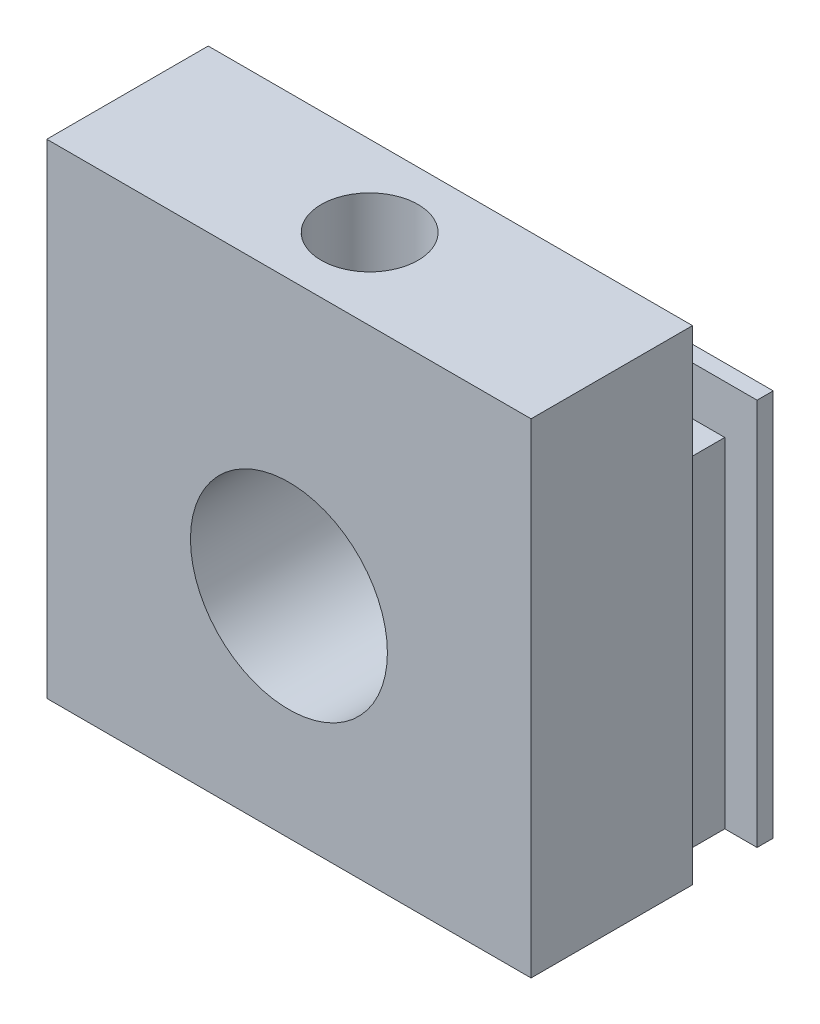
ISO-10303-21;
HEADER;
FILE_DESCRIPTION(('STEP AP214'),'2;1');
FILE_NAME('part.step','',(''),(''),'','','');
FILE_SCHEMA(('AUTOMOTIVE_DESIGN { 1 0 10303 214 1 1 1 1 }'));
ENDSEC;
DATA;
#1=APPLICATION_CONTEXT('core data for automotive mechanical design processes');
#2=APPLICATION_PROTOCOL_DEFINITION('international standard','automotive_design',2000,#1);
#3=PRODUCT_CONTEXT('',#1,'mechanical');
#4=PRODUCT('Part','Part','',(#3));
#5=PRODUCT_RELATED_PRODUCT_CATEGORY('part','',(#4));
#6=PRODUCT_DEFINITION_FORMATION('','',#4);
#7=PRODUCT_DEFINITION_CONTEXT('part definition',#1,'design');
#8=PRODUCT_DEFINITION('design','',#6,#7);
#9=PRODUCT_DEFINITION_SHAPE('','',#8);
#10=(LENGTH_UNIT() NAMED_UNIT(*) SI_UNIT(.MILLI.,.METRE.));
#11=(NAMED_UNIT(*) PLANE_ANGLE_UNIT() SI_UNIT($,.RADIAN.));
#12=(NAMED_UNIT(*) SI_UNIT($,.STERADIAN.) SOLID_ANGLE_UNIT());
#13=UNCERTAINTY_MEASURE_WITH_UNIT(LENGTH_MEASURE(1.E-05),#10,'distance_accuracy_value','');
#14=(GEOMETRIC_REPRESENTATION_CONTEXT(3) GLOBAL_UNCERTAINTY_ASSIGNED_CONTEXT((#13)) GLOBAL_UNIT_ASSIGNED_CONTEXT((#10,
#11,#12)) REPRESENTATION_CONTEXT('',''));
#15=CARTESIAN_POINT('',(0.,0.,0.));
#16=DIRECTION('',(0.,0.,1.));
#17=DIRECTION('',(1.,0.,0.));
#18=AXIS2_PLACEMENT_3D('',#15,#16,#17);
#19=CARTESIAN_POINT('',(0.,0.,0.));
#20=DIRECTION('',(0.,0.,1.));
#21=DIRECTION('',(1.,0.,0.));
#22=AXIS2_PLACEMENT_3D('',#19,#20,#21);
#23=PLANE('',#22);
#24=DIRECTION('',(0.,1.,0.));
#25=VECTOR('',#24,1.);
#26=CARTESIAN_POINT('',(-6.5,-7.5,0.));
#27=LINE('',#26,#25);
#28=CARTESIAN_POINT('',(-6.5,-7.5,0.));
#29=VERTEX_POINT('',#28);
#30=CARTESIAN_POINT('',(-6.5,3.,0.));
#31=VERTEX_POINT('',#30);
#32=EDGE_CURVE('E211',#29,#31,#27,.T.);
#33=ORIENTED_EDGE('',*,*,#32,.F.);
#34=DIRECTION('',(1.,0.,0.));
#35=VECTOR('',#34,1.);
#36=CARTESIAN_POINT('',(-7.5,-7.5,0.));
#37=LINE('',#36,#35);
#38=CARTESIAN_POINT('',(-7.5,-7.5,0.));
#39=VERTEX_POINT('',#38);
#40=EDGE_CURVE('E253',#39,#29,#37,.T.);
#41=ORIENTED_EDGE('',*,*,#40,.F.);
#42=DIRECTION('',(0.,-1.,0.));
#43=VECTOR('',#42,1.);
#44=CARTESIAN_POINT('',(-7.5,7.5,0.));
#45=LINE('',#44,#43);
#46=CARTESIAN_POINT('',(-7.5,7.5,0.));
#47=VERTEX_POINT('',#46);
#48=EDGE_CURVE('E234',#47,#39,#45,.T.);
#49=ORIENTED_EDGE('',*,*,#48,.F.);
#50=DIRECTION('',(-1.,0.,0.));
#51=VECTOR('',#50,1.);
#52=CARTESIAN_POINT('',(-7.5,7.5,0.));
#53=LINE('',#52,#51);
#54=CARTESIAN_POINT('',(7.5,7.5,0.));
#55=VERTEX_POINT('',#54);
#56=EDGE_CURVE('E84',#55,#47,#53,.T.);
#57=ORIENTED_EDGE('',*,*,#56,.F.);
#58=DIRECTION('',(0.,1.,0.));
#59=VECTOR('',#58,1.);
#60=CARTESIAN_POINT('',(7.5,7.5,0.));
#61=LINE('',#60,#59);
#62=CARTESIAN_POINT('',(7.5,-7.5,0.));
#63=VERTEX_POINT('',#62);
#64=EDGE_CURVE('E257',#63,#55,#61,.T.);
#65=ORIENTED_EDGE('',*,*,#64,.F.);
#66=CARTESIAN_POINT('',(6.5,-7.5,0.));
#67=VERTEX_POINT('',#66);
#68=EDGE_CURVE('E252',#67,#63,#37,.T.);
#69=ORIENTED_EDGE('',*,*,#68,.F.);
#70=DIRECTION('',(0.,1.,0.));
#71=VECTOR('',#70,1.);
#72=CARTESIAN_POINT('',(6.5,-7.5,0.));
#73=LINE('',#72,#71);
#74=CARTESIAN_POINT('',(6.5,3.,0.));
#75=VERTEX_POINT('',#74);
#76=EDGE_CURVE('E200',#67,#75,#73,.T.);
#77=ORIENTED_EDGE('',*,*,#76,.T.);
#78=DIRECTION('',(-1.,0.,0.));
#79=VECTOR('',#78,1.);
#80=CARTESIAN_POINT('',(6.5,3.,0.));
#81=LINE('',#80,#79);
#82=EDGE_CURVE('E54',#75,#31,#81,.T.);
#83=ORIENTED_EDGE('',*,*,#82,.T.);
#84=EDGE_LOOP('',(#33,#41,#49,#57,#65,#69,#77,#83));
#85=FACE_BOUND('',#84,.T.);
#86=ADVANCED_FACE('F38',(#85),#23,.F.);
#87=CARTESIAN_POINT('',(-7.5,7.5,5.));
#88=DIRECTION('',(1.,0.,0.));
#89=DIRECTION('',(0.,1.,0.));
#90=AXIS2_PLACEMENT_3D('',#87,#88,#89);
#91=PLANE('',#90);
#92=ORIENTED_EDGE('',*,*,#48,.T.);
#93=DIRECTION('',(0.,0.,-1.));
#94=VECTOR('',#93,1.);
#95=CARTESIAN_POINT('',(-7.5,-7.5,5.));
#96=LINE('',#95,#94);
#97=CARTESIAN_POINT('',(-7.5,-7.5,5.));
#98=VERTEX_POINT('',#97);
#99=EDGE_CURVE('E11',#98,#39,#96,.T.);
#100=ORIENTED_EDGE('',*,*,#99,.F.);
#101=DIRECTION('',(0.,-1.,0.));
#102=VECTOR('',#101,1.);
#103=CARTESIAN_POINT('',(-7.5,7.5,5.));
#104=LINE('',#103,#102);
#105=CARTESIAN_POINT('',(-7.5,7.5,5.));
#106=VERTEX_POINT('',#105);
#107=EDGE_CURVE('E238',#106,#98,#104,.T.);
#108=ORIENTED_EDGE('',*,*,#107,.F.);
#109=DIRECTION('',(0.,0.,-1.));
#110=VECTOR('',#109,1.);
#111=CARTESIAN_POINT('',(-7.5,7.5,5.));
#112=LINE('',#111,#110);
#113=EDGE_CURVE('E248',#106,#47,#112,.T.);
#114=ORIENTED_EDGE('',*,*,#113,.T.);
#115=EDGE_LOOP('',(#92,#100,#108,#114));
#116=FACE_BOUND('',#115,.T.);
#117=ADVANCED_FACE('F40',(#116),#91,.F.);
#118=CARTESIAN_POINT('',(-7.5,-7.5,5.));
#119=DIRECTION('',(0.,1.,0.));
#120=DIRECTION('',(-1.,0.,0.));
#121=AXIS2_PLACEMENT_3D('',#118,#119,#120);
#122=PLANE('',#121);
#123=ORIENTED_EDGE('',*,*,#40,.T.);
#124=DIRECTION('',(0.,0.,1.));
#125=VECTOR('',#124,1.);
#126=CARTESIAN_POINT('',(-6.5,-7.5,-2.));
#127=LINE('',#126,#125);
#128=CARTESIAN_POINT('',(-6.5,-7.5,-2.));
#129=VERTEX_POINT('',#128);
#130=EDGE_CURVE('E225',#129,#29,#127,.T.);
#131=ORIENTED_EDGE('',*,*,#130,.F.);
#132=DIRECTION('',(-1.,0.,0.));
#133=VECTOR('',#132,1.);
#134=CARTESIAN_POINT('',(7.5,-7.5,-2.));
#135=LINE('',#134,#133);
#136=CARTESIAN_POINT('',(-7.5,-7.5,-2.));
#137=VERTEX_POINT('',#136);
#138=EDGE_CURVE('E185',#129,#137,#135,.T.);
#139=ORIENTED_EDGE('',*,*,#138,.T.);
#140=DIRECTION('',(0.,0.,1.));
#141=VECTOR('',#140,1.);
#142=CARTESIAN_POINT('',(-7.5,-7.5,-2.5));
#143=LINE('',#142,#141);
#144=CARTESIAN_POINT('',(-7.5,-7.5,-2.5));
#145=VERTEX_POINT('',#144);
#146=EDGE_CURVE('E160',#145,#137,#143,.T.);
#147=ORIENTED_EDGE('',*,*,#146,.F.);
#148=DIRECTION('',(-1.,0.,0.));
#149=VECTOR('',#148,1.);
#150=CARTESIAN_POINT('',(7.5,-7.5,-2.5));
#151=LINE('',#150,#149);
#152=CARTESIAN_POINT('',(7.5,-7.5,-2.5));
#153=VERTEX_POINT('',#152);
#154=EDGE_CURVE('E145',#153,#145,#151,.T.);
#155=ORIENTED_EDGE('',*,*,#154,.F.);
#156=DIRECTION('',(0.,0.,1.));
#157=VECTOR('',#156,1.);
#158=CARTESIAN_POINT('',(7.5,-7.5,-2.5));
#159=LINE('',#158,#157);
#160=CARTESIAN_POINT('',(7.5,-7.5,-2.));
#161=VERTEX_POINT('',#160);
#162=EDGE_CURVE('E191',#153,#161,#159,.T.);
#163=ORIENTED_EDGE('',*,*,#162,.T.);
#164=CARTESIAN_POINT('',(6.5,-7.5,-2.));
#165=VERTEX_POINT('',#164);
#166=EDGE_CURVE('E170',#161,#165,#135,.T.);
#167=ORIENTED_EDGE('',*,*,#166,.T.);
#168=DIRECTION('',(0.,0.,1.));
#169=VECTOR('',#168,1.);
#170=CARTESIAN_POINT('',(6.5,-7.5,-2.));
#171=LINE('',#170,#169);
#172=EDGE_CURVE('E222',#165,#67,#171,.T.);
#173=ORIENTED_EDGE('',*,*,#172,.T.);
#174=ORIENTED_EDGE('',*,*,#68,.T.);
#175=DIRECTION('',(0.,0.,-1.));
#176=VECTOR('',#175,1.);
#177=CARTESIAN_POINT('',(7.5,-7.5,5.));
#178=LINE('',#177,#176);
#179=CARTESIAN_POINT('',(7.5,-7.5,5.));
#180=VERTEX_POINT('',#179);
#181=EDGE_CURVE('E47',#180,#63,#178,.T.);
#182=ORIENTED_EDGE('',*,*,#181,.F.);
#183=DIRECTION('',(1.,0.,0.));
#184=VECTOR('',#183,1.);
#185=CARTESIAN_POINT('',(-7.5,-7.5,5.));
#186=LINE('',#185,#184);
#187=EDGE_CURVE('E91',#98,#180,#186,.T.);
#188=ORIENTED_EDGE('',*,*,#187,.F.);
#189=ORIENTED_EDGE('',*,*,#99,.T.);
#190=EDGE_LOOP('',(#123,#131,#139,#147,#155,#163,#167,#173,#174,#182,#188,#189));
#191=FACE_BOUND('',#190,.T.);
#192=ADVANCED_FACE('F292',(#191),#122,.F.);
#193=CARTESIAN_POINT('',(7.5,7.5,5.));
#194=DIRECTION('',(-1.,0.,0.));
#195=DIRECTION('',(0.,-1.,0.));
#196=AXIS2_PLACEMENT_3D('',#193,#194,#195);
#197=PLANE('',#196);
#198=ORIENTED_EDGE('',*,*,#64,.T.);
#199=DIRECTION('',(0.,0.,-1.));
#200=VECTOR('',#199,1.);
#201=CARTESIAN_POINT('',(7.5,7.5,5.));
#202=LINE('',#201,#200);
#203=CARTESIAN_POINT('',(7.5,7.5,5.));
#204=VERTEX_POINT('',#203);
#205=EDGE_CURVE('E264',#204,#55,#202,.T.);
#206=ORIENTED_EDGE('',*,*,#205,.F.);
#207=DIRECTION('',(0.,1.,0.));
#208=VECTOR('',#207,1.);
#209=CARTESIAN_POINT('',(7.5,7.5,5.));
#210=LINE('',#209,#208);
#211=EDGE_CURVE('E243',#180,#204,#210,.T.);
#212=ORIENTED_EDGE('',*,*,#211,.F.);
#213=ORIENTED_EDGE('',*,*,#181,.T.);
#214=EDGE_LOOP('',(#198,#206,#212,#213));
#215=FACE_BOUND('',#214,.T.);
#216=ADVANCED_FACE('F271',(#215),#197,.F.);
#217=CARTESIAN_POINT('',(-7.5,7.5,5.));
#218=DIRECTION('',(0.,-1.,0.));
#219=DIRECTION('',(0.,0.,-1.));
#220=AXIS2_PLACEMENT_3D('',#217,#218,#219);
#221=PLANE('',#220);
#222=CARTESIAN_POINT('',(0.,7.5,2.5));
#223=DIRECTION('',(0.,1.,0.));
#224=DIRECTION('',(0.,0.,1.));
#225=AXIS2_PLACEMENT_3D('',#222,#223,#224);
#226=CIRCLE('',#225,1.5);
#227=CARTESIAN_POINT('',(0.,7.5,4.));
#228=VERTEX_POINT('',#227);
#229=EDGE_CURVE('E221',#228,#228,#226,.T.);
#230=ORIENTED_EDGE('',*,*,#229,.F.);
#231=EDGE_LOOP('',(#230));
#232=FACE_BOUND('',#231,.T.);
#233=ORIENTED_EDGE('',*,*,#56,.T.);
#234=ORIENTED_EDGE('',*,*,#113,.F.);
#235=DIRECTION('',(-1.,0.,0.));
#236=VECTOR('',#235,1.);
#237=CARTESIAN_POINT('',(-7.5,7.5,5.));
#238=LINE('',#237,#236);
#239=EDGE_CURVE('E63',#204,#106,#238,.T.);
#240=ORIENTED_EDGE('',*,*,#239,.F.);
#241=ORIENTED_EDGE('',*,*,#205,.T.);
#242=EDGE_LOOP('',(#233,#234,#240,#241));
#243=FACE_BOUND('',#242,.T.);
#244=ADVANCED_FACE('F280',(#232,#243),#221,.F.);
#245=CARTESIAN_POINT('',(0.,0.,5.));
#246=DIRECTION('',(0.,0.,1.));
#247=DIRECTION('',(1.,0.,0.));
#248=AXIS2_PLACEMENT_3D('',#245,#246,#247);
#249=PLANE('',#248);
#250=CARTESIAN_POINT('',(0.,-1.,5.));
#251=DIRECTION('',(0.,0.,1.));
#252=DIRECTION('',(1.,0.,0.));
#253=AXIS2_PLACEMENT_3D('',#250,#251,#252);
#254=CIRCLE('',#253,3.05);
#255=CARTESIAN_POINT('',(3.05,-1.,5.));
#256=VERTEX_POINT('',#255);
#257=EDGE_CURVE('E344',#256,#256,#254,.T.);
#258=ORIENTED_EDGE('',*,*,#257,.F.);
#259=EDGE_LOOP('',(#258));
#260=FACE_BOUND('',#259,.T.);
#261=ORIENTED_EDGE('',*,*,#107,.T.);
#262=ORIENTED_EDGE('',*,*,#187,.T.);
#263=ORIENTED_EDGE('',*,*,#211,.T.);
#264=ORIENTED_EDGE('',*,*,#239,.T.);
#265=EDGE_LOOP('',(#261,#262,#263,#264));
#266=FACE_BOUND('',#265,.T.);
#267=ADVANCED_FACE('F282',(#260,#266),#249,.T.);
#268=CARTESIAN_POINT('',(0.,4.5,2.5));
#269=DIRECTION('',(0.,1.,0.));
#270=DIRECTION('',(0.,0.,1.));
#271=AXIS2_PLACEMENT_3D('',#268,#269,#270);
#272=CYLINDRICAL_SURFACE('',#271,1.5);
#273=CARTESIAN_POINT('',(0.,4.5,2.5));
#274=DIRECTION('',(0.,1.,0.));
#275=DIRECTION('',(0.,0.,1.));
#276=AXIS2_PLACEMENT_3D('',#273,#274,#275);
#277=CIRCLE('',#276,1.5);
#278=CARTESIAN_POINT('',(0.,4.5,4.));
#279=VERTEX_POINT('',#278);
#280=EDGE_CURVE('E230',#279,#279,#277,.T.);
#281=ORIENTED_EDGE('',*,*,#280,.F.);
#282=EDGE_LOOP('',(#281));
#283=FACE_BOUND('',#282,.T.);
#284=ORIENTED_EDGE('',*,*,#229,.T.);
#285=EDGE_LOOP('',(#284));
#286=FACE_BOUND('',#285,.T.);
#287=ADVANCED_FACE('F289',(#283,#286),#272,.F.);
#288=CARTESIAN_POINT('',(0.,4.5,2.5));
#289=DIRECTION('',(0.,1.,0.));
#290=DIRECTION('',(0.,0.,1.));
#291=AXIS2_PLACEMENT_3D('',#288,#289,#290);
#292=PLANE('',#291);
#293=ORIENTED_EDGE('',*,*,#280,.T.);
#294=EDGE_LOOP('',(#293));
#295=FACE_BOUND('',#294,.T.);
#296=ADVANCED_FACE('F303',(#295),#292,.T.);
#297=CARTESIAN_POINT('',(6.5,3.,-2.));
#298=DIRECTION('',(0.,1.,0.));
#299=DIRECTION('',(-1.,0.,0.));
#300=AXIS2_PLACEMENT_3D('',#297,#298,#299);
#301=PLANE('',#300);
#302=ORIENTED_EDGE('',*,*,#82,.F.);
#303=DIRECTION('',(0.,0.,1.));
#304=VECTOR('',#303,1.);
#305=CARTESIAN_POINT('',(6.5,3.,-2.));
#306=LINE('',#305,#304);
#307=CARTESIAN_POINT('',(6.5,3.,-2.));
#308=VERTEX_POINT('',#307);
#309=EDGE_CURVE('E218',#308,#75,#306,.T.);
#310=ORIENTED_EDGE('',*,*,#309,.F.);
#311=DIRECTION('',(-1.,0.,0.));
#312=VECTOR('',#311,1.);
#313=CARTESIAN_POINT('',(6.5,3.,-2.));
#314=LINE('',#313,#312);
#315=CARTESIAN_POINT('',(-6.5,3.,-2.));
#316=VERTEX_POINT('',#315);
#317=EDGE_CURVE('E196',#308,#316,#314,.T.);
#318=ORIENTED_EDGE('',*,*,#317,.T.);
#319=DIRECTION('',(0.,0.,1.));
#320=VECTOR('',#319,1.);
#321=CARTESIAN_POINT('',(-6.5,3.,-2.));
#322=LINE('',#321,#320);
#323=EDGE_CURVE('E208',#316,#31,#322,.T.);
#324=ORIENTED_EDGE('',*,*,#323,.T.);
#325=EDGE_LOOP('',(#302,#310,#318,#324));
#326=FACE_BOUND('',#325,.T.);
#327=ADVANCED_FACE('F307',(#326),#301,.T.);
#328=CARTESIAN_POINT('',(6.5,-7.5,-2.));
#329=DIRECTION('',(1.,0.,0.));
#330=DIRECTION('',(0.,0.,-1.));
#331=AXIS2_PLACEMENT_3D('',#328,#329,#330);
#332=PLANE('',#331);
#333=ORIENTED_EDGE('',*,*,#76,.F.);
#334=ORIENTED_EDGE('',*,*,#172,.F.);
#335=DIRECTION('',(0.,1.,0.));
#336=VECTOR('',#335,1.);
#337=CARTESIAN_POINT('',(6.5,-7.5,-2.));
#338=LINE('',#337,#336);
#339=EDGE_CURVE('E204',#165,#308,#338,.T.);
#340=ORIENTED_EDGE('',*,*,#339,.T.);
#341=ORIENTED_EDGE('',*,*,#309,.T.);
#342=EDGE_LOOP('',(#333,#334,#340,#341));
#343=FACE_BOUND('',#342,.T.);
#344=ADVANCED_FACE('F311',(#343),#332,.T.);
#345=CARTESIAN_POINT('',(-6.5,-7.5,-2.));
#346=DIRECTION('',(1.,0.,0.));
#347=DIRECTION('',(0.,1.,0.));
#348=AXIS2_PLACEMENT_3D('',#345,#346,#347);
#349=PLANE('',#348);
#350=ORIENTED_EDGE('',*,*,#32,.T.);
#351=ORIENTED_EDGE('',*,*,#323,.F.);
#352=DIRECTION('',(0.,1.,0.));
#353=VECTOR('',#352,1.);
#354=CARTESIAN_POINT('',(-6.5,-7.5,-2.));
#355=LINE('',#354,#353);
#356=EDGE_CURVE('E199',#129,#316,#355,.T.);
#357=ORIENTED_EDGE('',*,*,#356,.F.);
#358=ORIENTED_EDGE('',*,*,#130,.T.);
#359=EDGE_LOOP('',(#350,#351,#357,#358));
#360=FACE_BOUND('',#359,.T.);
#361=ADVANCED_FACE('F312',(#360),#349,.F.);
#362=CARTESIAN_POINT('',(7.5,4.5,-2.5));
#363=DIRECTION('',(0.,1.,0.));
#364=DIRECTION('',(0.,0.,1.));
#365=AXIS2_PLACEMENT_3D('',#362,#363,#364);
#366=PLANE('',#365);
#367=DIRECTION('',(-1.,0.,0.));
#368=VECTOR('',#367,1.);
#369=CARTESIAN_POINT('',(7.5,4.5,-2.));
#370=LINE('',#369,#368);
#371=CARTESIAN_POINT('',(7.5,4.5,-2.));
#372=VERTEX_POINT('',#371);
#373=CARTESIAN_POINT('',(-7.5,4.5,-2.));
#374=VERTEX_POINT('',#373);
#375=EDGE_CURVE('E180',#372,#374,#370,.T.);
#376=ORIENTED_EDGE('',*,*,#375,.F.);
#377=DIRECTION('',(0.,0.,1.));
#378=VECTOR('',#377,1.);
#379=CARTESIAN_POINT('',(7.5,4.5,-2.5));
#380=LINE('',#379,#378);
#381=CARTESIAN_POINT('',(7.5,4.5,-2.5));
#382=VERTEX_POINT('',#381);
#383=EDGE_CURVE('E164',#382,#372,#380,.T.);
#384=ORIENTED_EDGE('',*,*,#383,.F.);
#385=DIRECTION('',(-1.,0.,0.));
#386=VECTOR('',#385,1.);
#387=CARTESIAN_POINT('',(7.5,4.5,-2.5));
#388=LINE('',#387,#386);
#389=CARTESIAN_POINT('',(-7.5,4.5,-2.5));
#390=VERTEX_POINT('',#389);
#391=EDGE_CURVE('E142',#382,#390,#388,.T.);
#392=ORIENTED_EDGE('',*,*,#391,.T.);
#393=DIRECTION('',(0.,0.,1.));
#394=VECTOR('',#393,1.);
#395=CARTESIAN_POINT('',(-7.5,4.5,-2.5));
#396=LINE('',#395,#394);
#397=EDGE_CURVE('E152',#390,#374,#396,.T.);
#398=ORIENTED_EDGE('',*,*,#397,.T.);
#399=EDGE_LOOP('',(#376,#384,#392,#398));
#400=FACE_BOUND('',#399,.T.);
#401=ADVANCED_FACE('F163',(#400),#366,.T.);
#402=CARTESIAN_POINT('',(7.5,-7.5,-2.5));
#403=DIRECTION('',(1.,0.,0.));
#404=DIRECTION('',(0.,0.,-1.));
#405=AXIS2_PLACEMENT_3D('',#402,#403,#404);
#406=PLANE('',#405);
#407=DIRECTION('',(0.,1.,0.));
#408=VECTOR('',#407,1.);
#409=CARTESIAN_POINT('',(7.5,-7.5,-2.));
#410=LINE('',#409,#408);
#411=EDGE_CURVE('E166',#161,#372,#410,.T.);
#412=ORIENTED_EDGE('',*,*,#411,.F.);
#413=ORIENTED_EDGE('',*,*,#162,.F.);
#414=DIRECTION('',(0.,1.,0.));
#415=VECTOR('',#414,1.);
#416=CARTESIAN_POINT('',(7.5,-7.5,-2.5));
#417=LINE('',#416,#415);
#418=EDGE_CURVE('E161',#153,#382,#417,.T.);
#419=ORIENTED_EDGE('',*,*,#418,.T.);
#420=ORIENTED_EDGE('',*,*,#383,.T.);
#421=EDGE_LOOP('',(#412,#413,#419,#420));
#422=FACE_BOUND('',#421,.T.);
#423=ADVANCED_FACE('F321',(#422),#406,.T.);
#424=CARTESIAN_POINT('',(-7.5,-7.5,-2.5));
#425=DIRECTION('',(1.,0.,0.));
#426=DIRECTION('',(0.,0.,-1.));
#427=AXIS2_PLACEMENT_3D('',#424,#425,#426);
#428=PLANE('',#427);
#429=DIRECTION('',(0.,1.,0.));
#430=VECTOR('',#429,1.);
#431=CARTESIAN_POINT('',(-7.5,-7.5,-2.));
#432=LINE('',#431,#430);
#433=EDGE_CURVE('E155',#137,#374,#432,.T.);
#434=ORIENTED_EDGE('',*,*,#433,.T.);
#435=ORIENTED_EDGE('',*,*,#397,.F.);
#436=DIRECTION('',(0.,1.,0.));
#437=VECTOR('',#436,1.);
#438=CARTESIAN_POINT('',(-7.5,-7.5,-2.5));
#439=LINE('',#438,#437);
#440=EDGE_CURVE('E137',#145,#390,#439,.T.);
#441=ORIENTED_EDGE('',*,*,#440,.F.);
#442=ORIENTED_EDGE('',*,*,#146,.T.);
#443=EDGE_LOOP('',(#434,#435,#441,#442));
#444=FACE_BOUND('',#443,.T.);
#445=ADVANCED_FACE('F153',(#444),#428,.F.);
#446=CARTESIAN_POINT('',(0.,0.,-2.5));
#447=DIRECTION('',(0.,0.,-1.));
#448=DIRECTION('',(-1.,0.,0.));
#449=AXIS2_PLACEMENT_3D('',#446,#447,#448);
#450=PLANE('',#449);
#451=CARTESIAN_POINT('',(0.,-1.,-2.5));
#452=DIRECTION('',(0.,0.,-1.));
#453=DIRECTION('',(-1.,0.,0.));
#454=AXIS2_PLACEMENT_3D('',#451,#452,#453);
#455=CIRCLE('',#454,3.05);
#456=CARTESIAN_POINT('',(-3.05,-1.,-2.5));
#457=VERTEX_POINT('',#456);
#458=EDGE_CURVE('E173',#457,#457,#455,.T.);
#459=ORIENTED_EDGE('',*,*,#458,.F.);
#460=EDGE_LOOP('',(#459));
#461=FACE_BOUND('',#460,.T.);
#462=ORIENTED_EDGE('',*,*,#391,.F.);
#463=ORIENTED_EDGE('',*,*,#418,.F.);
#464=ORIENTED_EDGE('',*,*,#154,.T.);
#465=ORIENTED_EDGE('',*,*,#440,.T.);
#466=EDGE_LOOP('',(#462,#463,#464,#465));
#467=FACE_BOUND('',#466,.T.);
#468=ADVANCED_FACE('F139',(#461,#467),#450,.T.);
#469=CARTESIAN_POINT('',(0.,0.,-2.));
#470=DIRECTION('',(0.,0.,-1.));
#471=DIRECTION('',(-1.,0.,0.));
#472=AXIS2_PLACEMENT_3D('',#469,#470,#471);
#473=PLANE('',#472);
#474=ORIENTED_EDGE('',*,*,#339,.F.);
#475=ORIENTED_EDGE('',*,*,#166,.F.);
#476=ORIENTED_EDGE('',*,*,#411,.T.);
#477=ORIENTED_EDGE('',*,*,#375,.T.);
#478=ORIENTED_EDGE('',*,*,#433,.F.);
#479=ORIENTED_EDGE('',*,*,#138,.F.);
#480=ORIENTED_EDGE('',*,*,#356,.T.);
#481=ORIENTED_EDGE('',*,*,#317,.F.);
#482=EDGE_LOOP('',(#474,#475,#476,#477,#478,#479,#480,#481));
#483=FACE_BOUND('',#482,.T.);
#484=ADVANCED_FACE('F327',(#483),#473,.F.);
#485=CARTESIAN_POINT('',(0.,-1.,-1.5));
#486=DIRECTION('',(0.,0.,-1.));
#487=DIRECTION('',(-1.,0.,0.));
#488=AXIS2_PLACEMENT_3D('',#485,#486,#487);
#489=CYLINDRICAL_SURFACE('',#488,3.05);
#490=ORIENTED_EDGE('',*,*,#458,.T.);
#491=EDGE_LOOP('',(#490));
#492=FACE_BOUND('',#491,.T.);
#493=ORIENTED_EDGE('',*,*,#257,.T.);
#494=EDGE_LOOP('',(#493));
#495=FACE_BOUND('',#494,.T.);
#496=ADVANCED_FACE('F330',(#492,#495),#489,.F.);
#497=CLOSED_SHELL('',(#86,#117,#192,#216,#244,#267,#287,#296,#327,#344,#361,#401,#423,#445,#468,
#484,#496));
#498=MANIFOLD_SOLID_BREP('B2',#497);
#499=ADVANCED_BREP_SHAPE_REPRESENTATION('',(#18,#498),#14);
#500=SHAPE_DEFINITION_REPRESENTATION(#9,#499);
ENDSEC;
END-ISO-10303-21;
